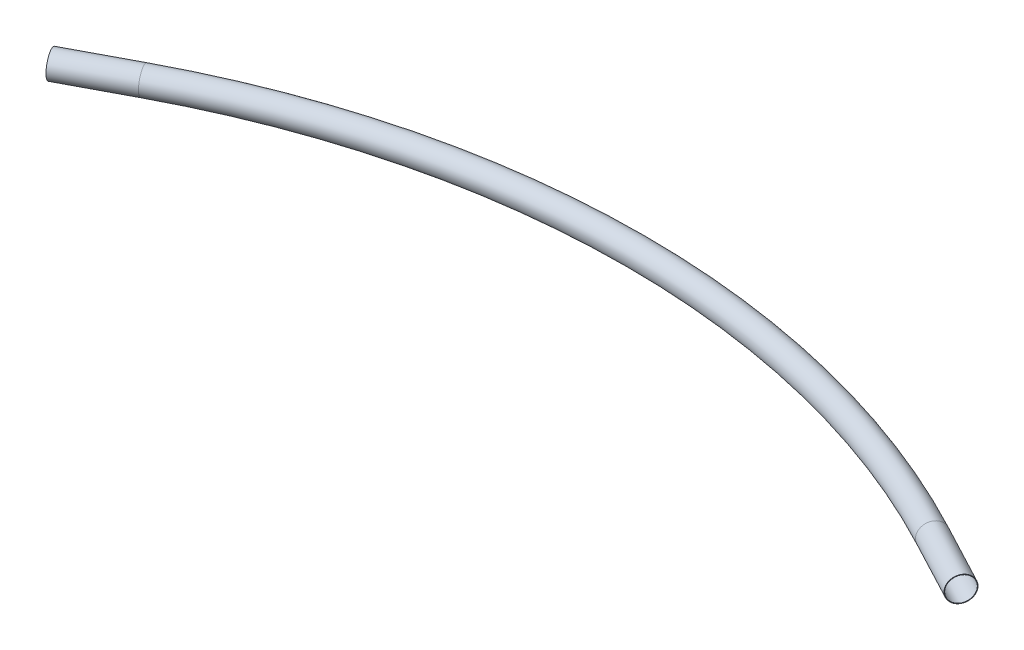
ISO-10303-21;
HEADER;
FILE_DESCRIPTION(('STEP AP214'),'2;1');
FILE_NAME('part.step','',(''),(''),'','','');
FILE_SCHEMA(('AUTOMOTIVE_DESIGN { 1 0 10303 214 1 1 1 1 }'));
ENDSEC;
DATA;
#1=APPLICATION_CONTEXT('core data for automotive mechanical design processes');
#2=APPLICATION_PROTOCOL_DEFINITION('international standard','automotive_design',2000,#1);
#3=PRODUCT_CONTEXT('',#1,'mechanical');
#4=PRODUCT('Part','Part','',(#3));
#5=PRODUCT_RELATED_PRODUCT_CATEGORY('part','',(#4));
#6=PRODUCT_DEFINITION_FORMATION('','',#4);
#7=PRODUCT_DEFINITION_CONTEXT('part definition',#1,'design');
#8=PRODUCT_DEFINITION('design','',#6,#7);
#9=PRODUCT_DEFINITION_SHAPE('','',#8);
#10=(LENGTH_UNIT() NAMED_UNIT(*) SI_UNIT(.MILLI.,.METRE.));
#11=(NAMED_UNIT(*) PLANE_ANGLE_UNIT() SI_UNIT($,.RADIAN.));
#12=(NAMED_UNIT(*) SI_UNIT($,.STERADIAN.) SOLID_ANGLE_UNIT());
#13=UNCERTAINTY_MEASURE_WITH_UNIT(LENGTH_MEASURE(1.E-05),#10,'distance_accuracy_value','');
#14=(GEOMETRIC_REPRESENTATION_CONTEXT(3) GLOBAL_UNCERTAINTY_ASSIGNED_CONTEXT((#13)) GLOBAL_UNIT_ASSIGNED_CONTEXT((#10,
#11,#12)) REPRESENTATION_CONTEXT('',''));
#15=CARTESIAN_POINT('',(0.,0.,0.));
#16=DIRECTION('',(0.,0.,1.));
#17=DIRECTION('',(1.,0.,0.));
#18=AXIS2_PLACEMENT_3D('',#15,#16,#17);
#19=CARTESIAN_POINT('',(-3039.39165417811,0.,213.778772000832));
#20=DIRECTION('',(0.883949374842753,0.,-0.467582615924828));
#21=DIRECTION('',(-0.467582615924828,0.,-0.883949374842753));
#22=AXIS2_PLACEMENT_3D('',#19,#20,#21);
#23=CYLINDRICAL_SURFACE('',#22,80.7339);
#24=CARTESIAN_POINT('',(-3039.39165417811,0.,213.778772000832));
#25=DIRECTION('',(-0.883949374842753,0.,0.467582615924828));
#26=DIRECTION('',(0.467582615924828,0.,0.883949374842753));
#27=AXIS2_PLACEMENT_3D('',#24,#25,#26);
#28=CIRCLE('',#27,80.7339);
#29=CARTESIAN_POINT('',(-3077.14142233392,0.,142.414091567214));
#30=VERTEX_POINT('',#29);
#31=EDGE_CURVE('E52',#30,#30,#28,.T.);
#32=CARTESIAN_POINT('',(-2635.25,0.,0.));
#33=DIRECTION('',(-0.883949374842753,0.,0.467582615924828));
#34=DIRECTION('',(0.467582615924828,0.,0.883949374842753));
#35=AXIS2_PLACEMENT_3D('',#32,#33,#34);
#36=CIRCLE('',#35,80.7339);
#37=CARTESIAN_POINT('',(-2672.99976815581,0.,-71.3646804336173));
#38=VERTEX_POINT('',#37);
#39=EDGE_CURVE('E58',#38,#38,#36,.T.);
#40=CARTESIAN_POINT('',(-3077.14142233392,0.,142.414091567214));
#41=CARTESIAN_POINT('',(-3072.93161343623,0.,140.187229358872));
#42=CARTESIAN_POINT('',(-3068.72180453854,0.,137.96036715053));
#43=CARTESIAN_POINT('',(-3060.30218674317,0.,133.506642733846));
#44=CARTESIAN_POINT('',(-3056.09237784548,0.,131.279780525504));
#45=CARTESIAN_POINT('',(-3047.6727600501,0.,126.82605610882));
#46=CARTESIAN_POINT('',(-3043.46295115241,0.,124.599193900478));
#47=CARTESIAN_POINT('',(-3035.04333335703,0.,120.145469483794));
#48=CARTESIAN_POINT('',(-3030.83352445935,0.,117.918607275452));
#49=CARTESIAN_POINT('',(-3022.41390666397,0.,113.464882858768));
#50=CARTESIAN_POINT('',(-3018.20409776628,0.,111.238020650426));
#51=CARTESIAN_POINT('',(-3009.7844799709,0.,106.784296233742));
#52=CARTESIAN_POINT('',(-3005.57467107321,0.,104.5574340254));
#53=CARTESIAN_POINT('',(-2997.15505327784,0.,100.103709608716));
#54=CARTESIAN_POINT('',(-2992.94524438015,0.,97.8768474003744));
#55=CARTESIAN_POINT('',(-2984.52562658477,0.,93.4231229836903));
#56=CARTESIAN_POINT('',(-2980.31581768708,0.,91.1962607753483));
#57=CARTESIAN_POINT('',(-2971.89619989171,0.,86.7425363586644));
#58=CARTESIAN_POINT('',(-2967.68639099402,0.,84.5156741503224));
#59=CARTESIAN_POINT('',(-2959.26677319864,0.,80.0619497336384));
#60=CARTESIAN_POINT('',(-2955.05696430095,0.,77.8350875252964));
#61=CARTESIAN_POINT('',(-2946.63734650557,0.,73.3813631086124));
#62=CARTESIAN_POINT('',(-2942.42753760789,0.,71.1545009002703));
#63=CARTESIAN_POINT('',(-2934.00791981251,0.,66.7007764835864));
#64=CARTESIAN_POINT('',(-2929.79811091482,0.,64.4739142752444));
#65=CARTESIAN_POINT('',(-2921.37849311944,0.,60.0201898585605));
#66=CARTESIAN_POINT('',(-2917.16868422175,0.,57.7933276502184));
#67=CARTESIAN_POINT('',(-2908.74906642638,0.,53.3396032335344));
#68=CARTESIAN_POINT('',(-2904.53925752869,0.,51.1127410251924));
#69=CARTESIAN_POINT('',(-2896.11963973331,0.,46.6590166085085));
#70=CARTESIAN_POINT('',(-2891.90983083562,0.,44.4321544001665));
#71=CARTESIAN_POINT('',(-2883.49021304024,0.,39.9784299834824));
#72=CARTESIAN_POINT('',(-2879.28040414256,0.,37.7515677751405));
#73=CARTESIAN_POINT('',(-2870.86078634718,0.,33.2978433584565));
#74=CARTESIAN_POINT('',(-2866.65097744949,0.,31.0709811501145));
#75=CARTESIAN_POINT('',(-2858.23135965411,0.,26.6172567334305));
#76=CARTESIAN_POINT('',(-2854.02155075642,0.,24.3903945250885));
#77=CARTESIAN_POINT('',(-2845.60193296105,0.,19.9366701084045));
#78=CARTESIAN_POINT('',(-2841.39212406336,0.,17.7098079000625));
#79=CARTESIAN_POINT('',(-2832.97250626798,0.,13.2560834833786));
#80=CARTESIAN_POINT('',(-2828.76269737029,0.,11.0292212750365));
#81=CARTESIAN_POINT('',(-2820.34307957492,0.,6.57549685835251));
#82=CARTESIAN_POINT('',(-2816.13327067723,0.,4.34863465001052));
#83=CARTESIAN_POINT('',(-2807.71365288185,0.,-0.10508976667346));
#84=CARTESIAN_POINT('',(-2803.50384398416,0.,-2.33195197501545));
#85=CARTESIAN_POINT('',(-2795.08422618878,0.,-6.78567639169943));
#86=CARTESIAN_POINT('',(-2790.8744172911,0.,-9.01253860004142));
#87=CARTESIAN_POINT('',(-2782.45479949572,0.,-13.4662630167254));
#88=CARTESIAN_POINT('',(-2778.24499059803,0.,-15.6931252250675));
#89=CARTESIAN_POINT('',(-2769.82537280265,0.,-20.1468496417514));
#90=CARTESIAN_POINT('',(-2765.61556390496,0.,-22.3737118500934));
#91=CARTESIAN_POINT('',(-2757.19594610959,0.,-26.8274362667774));
#92=CARTESIAN_POINT('',(-2752.9861372119,0.,-29.0542984751194));
#93=CARTESIAN_POINT('',(-2744.56651941652,0.,-33.5080228918034));
#94=CARTESIAN_POINT('',(-2740.35671051883,0.,-35.7348851001454));
#95=CARTESIAN_POINT('',(-2731.93709272345,0.,-40.1886095168294));
#96=CARTESIAN_POINT('',(-2727.72728382577,0.,-42.4154717251714));
#97=CARTESIAN_POINT('',(-2719.30766603039,0.,-46.8691961418554));
#98=CARTESIAN_POINT('',(-2715.0978571327,0.,-49.0960583501974));
#99=CARTESIAN_POINT('',(-2706.67823933732,0.,-53.5497827668813));
#100=CARTESIAN_POINT('',(-2702.46843043963,0.,-55.7766449752233));
#101=CARTESIAN_POINT('',(-2694.04881264426,0.,-60.2303693919073));
#102=CARTESIAN_POINT('',(-2689.83900374657,0.,-62.4572316002494));
#103=CARTESIAN_POINT('',(-2681.41938595119,0.,-66.9109560169334));
#104=CARTESIAN_POINT('',(-2677.2095770535,0.,-69.1378182252754));
#105=CARTESIAN_POINT('',(-2672.99976815581,0.,-71.3646804336173));
#106=B_SPLINE_CURVE_WITH_KNOTS('',3,(#40,#41,#42,#43,#44,#45,#46,#47,#48,#49,#50,#51,#52,#53,
#54,#55,#56,#57,#58,#59,#60,#61,#62,#63,#64,#65,#66,#67,#68,#69,#70,#71,#72,#73,#74,#75,#76,#77,
#78,#79,#80,#81,#82,#83,#84,#85,#86,#87,#88,#89,#90,#91,#92,#93,#94,#95,#96,#97,#98,#99,#100,
#101,#102,#103,#104,#105),.UNSPECIFIED.,.F.,.F.,(4,2,2,2,2,2,2,2,2,2,2,2,2,2,2,2,2,2,2,2,2,2,2,
2,2,2,2,2,2,2,2,2,4),(0.,14.2874999999999,28.5749999999999,42.8624999999998,57.1499999999998,
71.4374999999997,85.725,100.0125,114.3,128.5875,142.875,157.1625,171.45,185.7375,200.025,
214.3125,228.6,242.8875,257.175,271.4625,285.75,300.0375,314.325,328.6125,342.9,357.1875,
371.475,385.7625,400.05,414.3375,428.625,442.9125,457.2),.UNSPECIFIED.);
#107=EDGE_CURVE('BSEAM45',#30,#38,#106,.T.);
#108=ORIENTED_EDGE('',*,*,#31,.T.);
#109=ORIENTED_EDGE('',*,*,#39,.F.);
#110=ORIENTED_EDGE('',*,*,#107,.T.);
#111=ORIENTED_EDGE('',*,*,#107,.F.);
#112=EDGE_LOOP('',(#108,#110,#109,#111));
#113=FACE_BOUND('',#112,.T.);
#114=ADVANCED_FACE('F45',(#113),#23,.F.);
#115=CARTESIAN_POINT('',(-3039.39165417811,0.,213.778772000832));
#116=DIRECTION('',(0.883949374842753,0.,-0.467582615924828));
#117=DIRECTION('',(-0.467582615924828,0.,-0.883949374842753));
#118=AXIS2_PLACEMENT_3D('',#115,#116,#117);
#119=CYLINDRICAL_SURFACE('',#118,84.1375);
#120=CARTESIAN_POINT('',(-3039.39165417811,0.,213.778772000832));
#121=DIRECTION('',(-0.883949374842753,0.,0.467582615924828));
#122=DIRECTION('',(0.467582615924828,0.,0.883949374842753));
#123=AXIS2_PLACEMENT_3D('',#120,#121,#122);
#124=CIRCLE('',#123,84.1375);
#125=CARTESIAN_POINT('',(-3078.73288652548,0.,139.405481474999));
#126=VERTEX_POINT('',#125);
#127=EDGE_CURVE('E12',#126,#126,#124,.T.);
#128=CARTESIAN_POINT('',(-2635.25,0.,0.));
#129=DIRECTION('',(-0.883949374842753,0.,0.467582615924828));
#130=DIRECTION('',(0.467582615924828,0.,0.883949374842753));
#131=AXIS2_PLACEMENT_3D('',#128,#129,#130);
#132=CIRCLE('',#131,84.1375);
#133=CARTESIAN_POINT('',(-2674.59123234737,0.,-74.3732905258323));
#134=VERTEX_POINT('',#133);
#135=EDGE_CURVE('E48',#134,#134,#132,.T.);
#136=CARTESIAN_POINT('',(-3078.73288652548,0.,139.405481474999));
#137=CARTESIAN_POINT('',(-3074.52307762779,0.,137.178619266657));
#138=CARTESIAN_POINT('',(-3070.3132687301,0.,134.951757058315));
#139=CARTESIAN_POINT('',(-3061.89365093473,0.,130.498032641631));
#140=CARTESIAN_POINT('',(-3057.68384203704,0.,128.271170433289));
#141=CARTESIAN_POINT('',(-3049.26422424166,0.,123.817446016605));
#142=CARTESIAN_POINT('',(-3045.05441534397,0.,121.590583808263));
#143=CARTESIAN_POINT('',(-3036.6347975486,0.,117.136859391579));
#144=CARTESIAN_POINT('',(-3032.42498865091,0.,114.909997183237));
#145=CARTESIAN_POINT('',(-3024.00537085553,0.,110.456272766553));
#146=CARTESIAN_POINT('',(-3019.79556195784,0.,108.229410558211));
#147=CARTESIAN_POINT('',(-3011.37594416246,0.,103.775686141527));
#148=CARTESIAN_POINT('',(-3007.16613526478,0.,101.548823933185));
#149=CARTESIAN_POINT('',(-2998.7465174694,0.,97.0950995165014));
#150=CARTESIAN_POINT('',(-2994.53670857171,0.,94.8682373081594));
#151=CARTESIAN_POINT('',(-2986.11709077633,0.,90.4145128914754));
#152=CARTESIAN_POINT('',(-2981.90728187864,0.,88.1876506831334));
#153=CARTESIAN_POINT('',(-2973.48766408327,0.,83.7339262664494));
#154=CARTESIAN_POINT('',(-2969.27785518558,0.,81.5070640581074));
#155=CARTESIAN_POINT('',(-2960.8582373902,0.,77.0533396414234));
#156=CARTESIAN_POINT('',(-2956.64842849251,0.,74.8264774330814));
#157=CARTESIAN_POINT('',(-2948.22881069714,0.,70.3727530163975));
#158=CARTESIAN_POINT('',(-2944.01900179945,0.,68.1458908080555));
#159=CARTESIAN_POINT('',(-2935.59938400407,0.,63.6921663913714));
#160=CARTESIAN_POINT('',(-2931.38957510638,0.,61.4653041830294));
#161=CARTESIAN_POINT('',(-2922.969957311,0.,57.0115797663454));
#162=CARTESIAN_POINT('',(-2918.76014841331,0.,54.7847175580035));
#163=CARTESIAN_POINT('',(-2910.34053061794,0.,50.3309931413195));
#164=CARTESIAN_POINT('',(-2906.13072172025,0.,48.1041309329775));
#165=CARTESIAN_POINT('',(-2897.71110392487,0.,43.6504065162935));
#166=CARTESIAN_POINT('',(-2893.50129502718,0.,41.4235443079515));
#167=CARTESIAN_POINT('',(-2885.08167723181,0.,36.9698198912675));
#168=CARTESIAN_POINT('',(-2880.87186833412,0.,34.7429576829255));
#169=CARTESIAN_POINT('',(-2872.45225053874,0.,30.2892332662415));
#170=CARTESIAN_POINT('',(-2868.24244164105,0.,28.0623710578995));
#171=CARTESIAN_POINT('',(-2859.82282384567,0.,23.6086466412155));
#172=CARTESIAN_POINT('',(-2855.61301494799,0.,21.3817844328735));
#173=CARTESIAN_POINT('',(-2847.19339715261,0.,16.9280600161895));
#174=CARTESIAN_POINT('',(-2842.98358825492,0.,14.7011978078476));
#175=CARTESIAN_POINT('',(-2834.56397045954,0.,10.2474733911636));
#176=CARTESIAN_POINT('',(-2830.35416156185,0.,8.02061118282158));
#177=CARTESIAN_POINT('',(-2821.93454376648,0.,3.56688676613756));
#178=CARTESIAN_POINT('',(-2817.72473486879,0.,1.34002455779557));
#179=CARTESIAN_POINT('',(-2809.30511707341,0.,-3.11369985888842));
#180=CARTESIAN_POINT('',(-2805.09530817572,0.,-5.34056206723042));
#181=CARTESIAN_POINT('',(-2796.67569038034,0.,-9.79428648391441));
#182=CARTESIAN_POINT('',(-2792.46588148266,0.,-12.0211486922564));
#183=CARTESIAN_POINT('',(-2784.04626368728,0.,-16.4748731089404));
#184=CARTESIAN_POINT('',(-2779.83645478959,0.,-18.7017353172824));
#185=CARTESIAN_POINT('',(-2771.41683699421,0.,-23.1554597339664));
#186=CARTESIAN_POINT('',(-2767.20702809652,0.,-25.3823219423084));
#187=CARTESIAN_POINT('',(-2758.78741030115,0.,-29.8360463589924));
#188=CARTESIAN_POINT('',(-2754.57760140346,0.,-32.0629085673344));
#189=CARTESIAN_POINT('',(-2746.15798360808,0.,-36.5166329840183));
#190=CARTESIAN_POINT('',(-2741.94817471039,0.,-38.7434951923603));
#191=CARTESIAN_POINT('',(-2733.52855691502,0.,-43.1972196090443));
#192=CARTESIAN_POINT('',(-2729.31874801733,0.,-45.4240818173863));
#193=CARTESIAN_POINT('',(-2720.89913022195,0.,-49.8778062340703));
#194=CARTESIAN_POINT('',(-2716.68932132426,0.,-52.1046684424123));
#195=CARTESIAN_POINT('',(-2708.26970352888,0.,-56.5583928590963));
#196=CARTESIAN_POINT('',(-2704.0598946312,0.,-58.7852550674383));
#197=CARTESIAN_POINT('',(-2695.64027683582,0.,-63.2389794841223));
#198=CARTESIAN_POINT('',(-2691.43046793813,0.,-65.4658416924643));
#199=CARTESIAN_POINT('',(-2683.01085014275,0.,-69.9195661091483));
#200=CARTESIAN_POINT('',(-2678.80104124506,0.,-72.1464283174903));
#201=CARTESIAN_POINT('',(-2674.59123234737,0.,-74.3732905258323));
#202=B_SPLINE_CURVE_WITH_KNOTS('',3,(#136,#137,#138,#139,#140,#141,#142,#143,#144,#145,#146,
#147,#148,#149,#150,#151,#152,#153,#154,#155,#156,#157,#158,#159,#160,#161,#162,#163,#164,#165,
#166,#167,#168,#169,#170,#171,#172,#173,#174,#175,#176,#177,#178,#179,#180,#181,#182,#183,#184,
#185,#186,#187,#188,#189,#190,#191,#192,#193,#194,#195,#196,#197,#198,#199,#200,#201),
.UNSPECIFIED.,.F.,.F.,(4,2,2,2,2,2,2,2,2,2,2,2,2,2,2,2,2,2,2,2,2,2,2,2,2,2,2,2,2,2,2,2,4),(0.,
14.2874999999999,28.5749999999999,42.8624999999998,57.1499999999998,71.4374999999997,
85.7249999999997,100.0125,114.3,128.5875,142.875,157.1625,171.45,185.7375,200.025,214.3125,
228.6,242.8875,257.175,271.4625,285.75,300.0375,314.325,328.6125,342.9,357.1875,371.475,
385.7625,400.05,414.3375,428.625,442.9125,457.2),.UNSPECIFIED.);
#203=EDGE_CURVE('BSEAM65',#126,#134,#202,.T.);
#204=ORIENTED_EDGE('',*,*,#127,.F.);
#205=ORIENTED_EDGE('',*,*,#135,.T.);
#206=ORIENTED_EDGE('',*,*,#203,.T.);
#207=ORIENTED_EDGE('',*,*,#203,.F.);
#208=EDGE_LOOP('',(#204,#206,#205,#207));
#209=FACE_BOUND('',#208,.T.);
#210=ADVANCED_FACE('F65',(#209),#119,.T.);
#211=CARTESIAN_POINT('',(-3039.39165417811,0.,213.778772000832));
#212=DIRECTION('',(-0.883949374842753,0.,0.467582615924828));
#213=DIRECTION('',(0.467582615924828,0.,0.883949374842753));
#214=AXIS2_PLACEMENT_3D('',#211,#212,#213);
#215=PLANE('',#214);
#216=ORIENTED_EDGE('',*,*,#31,.F.);
#217=EDGE_LOOP('',(#216));
#218=FACE_BOUND('',#217,.T.);
#219=ORIENTED_EDGE('',*,*,#127,.T.);
#220=EDGE_LOOP('',(#219));
#221=FACE_BOUND('',#220,.T.);
#222=ADVANCED_FACE('F69',(#218,#221),#215,.T.);
#223=CARTESIAN_POINT('',(-2635.25,0.,0.));
#224=DIRECTION('',(-0.883949374842753,0.,0.467582615924828));
#225=DIRECTION('',(0.467582615924828,0.,0.883949374842753));
#226=AXIS2_PLACEMENT_3D('',#223,#224,#225);
#227=PLANE('',#226);
#228=ORIENTED_EDGE('',*,*,#39,.T.);
#229=EDGE_LOOP('',(#228));
#230=FACE_BOUND('',#229,.T.);
#231=ORIENTED_EDGE('',*,*,#135,.F.);
#232=EDGE_LOOP('',(#231));
#233=FACE_BOUND('',#232,.T.);
#234=ADVANCED_FACE('F67',(#230,#233),#227,.F.);
#235=CLOSED_SHELL('',(#114,#210,#222,#234));
#236=MANIFOLD_SOLID_BREP('B2',#235);
#237=CARTESIAN_POINT('',(0.,0.,4981.85242718447));
#238=DIRECTION('',(0.,-1.,0.));
#239=DIRECTION('',(0.,0.,-1.));
#240=AXIS2_PLACEMENT_3D('',#237,#238,#239);
#241=TOROIDAL_SURFACE('',#240,5635.90242718447,80.7339);
#242=CARTESIAN_POINT('',(-2635.25,0.,4.44089209850063E-13));
#243=DIRECTION('',(-0.883949374842753,0.,0.467582615924828));
#244=DIRECTION('',(0.467582615924828,0.,0.883949374842753));
#245=AXIS2_PLACEMENT_3D('',#242,#243,#244);
#246=CIRCLE('',#245,80.7339);
#247=CARTESIAN_POINT('',(-2672.99976815581,0.,-71.3646804336179));
#248=VERTEX_POINT('',#247);
#249=EDGE_CURVE('E129',#248,#248,#246,.T.);
#250=CARTESIAN_POINT('',(2635.25,0.,0.));
#251=DIRECTION('',(-0.883949374842754,0.,-0.467582615924828));
#252=DIRECTION('',(-0.467582615924828,0.,0.883949374842754));
#253=AXIS2_PLACEMENT_3D('',#250,#251,#252);
#254=CIRCLE('',#253,80.7339);
#255=CARTESIAN_POINT('',(2672.99976815581,0.,-71.3646804336179));
#256=VERTEX_POINT('',#255);
#257=EDGE_CURVE('E137',#256,#256,#254,.T.);
#258=CARTESIAN_POINT('',(0.,0.,4981.85242718447));
#259=DIRECTION('',(0.,-1.,0.));
#260=DIRECTION('',(0.,0.,-1.));
#261=AXIS2_PLACEMENT_3D('',#258,#259,#260);
#262=CIRCLE('',#261,5716.63632718447);
#263=EDGE_CURVE('',#248,#256,#262,.T.);
#264=ORIENTED_EDGE('',*,*,#249,.T.);
#265=ORIENTED_EDGE('',*,*,#257,.F.);
#266=ORIENTED_EDGE('',*,*,#263,.T.);
#267=ORIENTED_EDGE('',*,*,#263,.F.);
#268=EDGE_LOOP('',(#264,#266,#265,#267));
#269=FACE_BOUND('',#268,.T.);
#270=ADVANCED_FACE('F122',(#269),#241,.F.);
#271=CARTESIAN_POINT('',(0.,0.,4981.85242718447));
#272=DIRECTION('',(0.,-1.,0.));
#273=DIRECTION('',(0.,0.,-1.));
#274=AXIS2_PLACEMENT_3D('',#271,#272,#273);
#275=TOROIDAL_SURFACE('',#274,5635.90242718447,84.1375);
#276=CARTESIAN_POINT('',(-2635.25,0.,4.44089209850063E-13));
#277=DIRECTION('',(-0.883949374842753,0.,0.467582615924828));
#278=DIRECTION('',(0.467582615924828,0.,0.883949374842753));
#279=AXIS2_PLACEMENT_3D('',#276,#277,#278);
#280=CIRCLE('',#279,84.1375);
#281=CARTESIAN_POINT('',(-2674.59123234738,0.,-74.3732905258323));
#282=VERTEX_POINT('',#281);
#283=EDGE_CURVE('E44',#282,#282,#280,.T.);
#284=CARTESIAN_POINT('',(2635.25,0.,0.));
#285=DIRECTION('',(-0.883949374842754,0.,-0.467582615924828));
#286=DIRECTION('',(-0.467582615924828,0.,0.883949374842754));
#287=AXIS2_PLACEMENT_3D('',#284,#285,#286);
#288=CIRCLE('',#287,84.1375);
#289=CARTESIAN_POINT('',(2674.59123234737,0.,-74.3732905258323));
#290=VERTEX_POINT('',#289);
#291=EDGE_CURVE('E133',#290,#290,#288,.T.);
#292=CARTESIAN_POINT('',(0.,0.,4981.85242718447));
#293=DIRECTION('',(0.,-1.,0.));
#294=DIRECTION('',(0.,0.,-1.));
#295=AXIS2_PLACEMENT_3D('',#292,#293,#294);
#296=CIRCLE('',#295,5720.03992718447);
#297=EDGE_CURVE('',#282,#290,#296,.T.);
#298=ORIENTED_EDGE('',*,*,#283,.F.);
#299=ORIENTED_EDGE('',*,*,#291,.T.);
#300=ORIENTED_EDGE('',*,*,#297,.T.);
#301=ORIENTED_EDGE('',*,*,#297,.F.);
#302=EDGE_LOOP('',(#298,#300,#299,#301));
#303=FACE_BOUND('',#302,.T.);
#304=ADVANCED_FACE('F124',(#303),#275,.T.);
#305=CARTESIAN_POINT('',(-2635.25,0.,4.44089209850063E-13));
#306=DIRECTION('',(-0.883949374842753,0.,0.467582615924828));
#307=DIRECTION('',(0.467582615924828,0.,0.883949374842753));
#308=AXIS2_PLACEMENT_3D('',#305,#306,#307);
#309=PLANE('',#308);
#310=ORIENTED_EDGE('',*,*,#249,.F.);
#311=EDGE_LOOP('',(#310));
#312=FACE_BOUND('',#311,.T.);
#313=ORIENTED_EDGE('',*,*,#283,.T.);
#314=EDGE_LOOP('',(#313));
#315=FACE_BOUND('',#314,.T.);
#316=ADVANCED_FACE('F147',(#312,#315),#309,.T.);
#317=CARTESIAN_POINT('',(2635.25,0.,0.));
#318=DIRECTION('',(-0.883949374842754,0.,-0.467582615924828));
#319=DIRECTION('',(-0.467582615924828,0.,0.883949374842754));
#320=AXIS2_PLACEMENT_3D('',#317,#318,#319);
#321=PLANE('',#320);
#322=ORIENTED_EDGE('',*,*,#257,.T.);
#323=EDGE_LOOP('',(#322));
#324=FACE_BOUND('',#323,.T.);
#325=ORIENTED_EDGE('',*,*,#291,.F.);
#326=EDGE_LOOP('',(#325));
#327=FACE_BOUND('',#326,.T.);
#328=ADVANCED_FACE('F143',(#324,#327),#321,.F.);
#329=CLOSED_SHELL('',(#270,#304,#316,#328));
#330=MANIFOLD_SOLID_BREP('B7',#329);
#331=CARTESIAN_POINT('',(2635.25,0.,0.));
#332=DIRECTION('',(0.883949374842753,0.,0.467582615924828));
#333=DIRECTION('',(0.467582615924828,0.,-0.883949374842753));
#334=AXIS2_PLACEMENT_3D('',#331,#332,#333);
#335=CYLINDRICAL_SURFACE('',#334,80.7339);
#336=CARTESIAN_POINT('',(2635.25,0.,0.));
#337=DIRECTION('',(-0.883949374842754,0.,-0.467582615924828));
#338=DIRECTION('',(-0.467582615924828,0.,0.883949374842754));
#339=AXIS2_PLACEMENT_3D('',#336,#337,#338);
#340=CIRCLE('',#339,80.7339);
#341=CARTESIAN_POINT('',(2672.99976815581,0.,-71.3646804336173));
#342=VERTEX_POINT('',#341);
#343=EDGE_CURVE('E199',#342,#342,#340,.T.);
#344=CARTESIAN_POINT('',(3039.39165417811,0.,213.778772000832));
#345=DIRECTION('',(-0.883949374842754,0.,-0.467582615924828));
#346=DIRECTION('',(-0.467582615924828,0.,0.883949374842754));
#347=AXIS2_PLACEMENT_3D('',#344,#345,#346);
#348=CIRCLE('',#347,80.7339);
#349=CARTESIAN_POINT('',(3077.14142233392,0.,142.414091567214));
#350=VERTEX_POINT('',#349);
#351=EDGE_CURVE('E205',#350,#350,#348,.T.);
#352=CARTESIAN_POINT('',(2672.99976815581,0.,-71.3646804336173));
#353=CARTESIAN_POINT('',(2677.2095770535,0.,-69.1378182252752));
#354=CARTESIAN_POINT('',(2681.41938595119,0.,-66.9109560169333));
#355=CARTESIAN_POINT('',(2689.83900374657,0.,-62.4572316002493));
#356=CARTESIAN_POINT('',(2694.04881264426,0.,-60.2303693919074));
#357=CARTESIAN_POINT('',(2702.46843043963,0.,-55.7766449752234));
#358=CARTESIAN_POINT('',(2706.67823933732,0.,-53.5497827668814));
#359=CARTESIAN_POINT('',(2715.0978571327,0.,-49.0960583501974));
#360=CARTESIAN_POINT('',(2719.30766603039,0.,-46.8691961418554));
#361=CARTESIAN_POINT('',(2727.72728382577,0.,-42.4154717251714));
#362=CARTESIAN_POINT('',(2731.93709272345,0.,-40.1886095168294));
#363=CARTESIAN_POINT('',(2740.35671051883,0.,-35.7348851001454));
#364=CARTESIAN_POINT('',(2744.56651941652,0.,-33.5080228918034));
#365=CARTESIAN_POINT('',(2752.9861372119,0.,-29.0542984751194));
#366=CARTESIAN_POINT('',(2757.19594610959,0.,-26.8274362667774));
#367=CARTESIAN_POINT('',(2765.61556390496,0.,-22.3737118500934));
#368=CARTESIAN_POINT('',(2769.82537280265,0.,-20.1468496417514));
#369=CARTESIAN_POINT('',(2778.24499059803,0.,-15.6931252250674));
#370=CARTESIAN_POINT('',(2782.45479949572,0.,-13.4662630167255));
#371=CARTESIAN_POINT('',(2790.8744172911,0.,-9.01253860004149));
#372=CARTESIAN_POINT('',(2795.08422618878,0.,-6.78567639169947));
#373=CARTESIAN_POINT('',(2803.50384398416,0.,-2.33195197501546));
#374=CARTESIAN_POINT('',(2807.71365288185,0.,-0.105089766673477));
#375=CARTESIAN_POINT('',(2816.13327067723,0.,4.34863465001051));
#376=CARTESIAN_POINT('',(2820.34307957492,0.,6.57549685835251));
#377=CARTESIAN_POINT('',(2828.76269737029,0.,11.0292212750365));
#378=CARTESIAN_POINT('',(2832.97250626798,0.,13.2560834833785));
#379=CARTESIAN_POINT('',(2841.39212406336,0.,17.7098079000625));
#380=CARTESIAN_POINT('',(2845.60193296105,0.,19.9366701084045));
#381=CARTESIAN_POINT('',(2854.02155075642,0.,24.3903945250885));
#382=CARTESIAN_POINT('',(2858.23135965411,0.,26.6172567334304));
#383=CARTESIAN_POINT('',(2866.65097744949,0.,31.0709811501144));
#384=CARTESIAN_POINT('',(2870.86078634718,0.,33.2978433584564));
#385=CARTESIAN_POINT('',(2879.28040414256,0.,37.7515677751405));
#386=CARTESIAN_POINT('',(2883.49021304024,0.,39.9784299834824));
#387=CARTESIAN_POINT('',(2891.90983083562,0.,44.4321544001664));
#388=CARTESIAN_POINT('',(2896.11963973331,0.,46.6590166085084));
#389=CARTESIAN_POINT('',(2904.53925752869,0.,51.1127410251924));
#390=CARTESIAN_POINT('',(2908.74906642638,0.,53.3396032335344));
#391=CARTESIAN_POINT('',(2917.16868422175,0.,57.7933276502184));
#392=CARTESIAN_POINT('',(2921.37849311944,0.,60.0201898585604));
#393=CARTESIAN_POINT('',(2929.79811091482,0.,64.4739142752444));
#394=CARTESIAN_POINT('',(2934.00791981251,0.,66.7007764835864));
#395=CARTESIAN_POINT('',(2942.42753760788,0.,71.1545009002704));
#396=CARTESIAN_POINT('',(2946.63734650557,0.,73.3813631086123));
#397=CARTESIAN_POINT('',(2955.05696430095,0.,77.8350875252963));
#398=CARTESIAN_POINT('',(2959.26677319864,0.,80.0619497336383));
#399=CARTESIAN_POINT('',(2967.68639099402,0.,84.5156741503224));
#400=CARTESIAN_POINT('',(2971.89619989171,0.,86.7425363586643));
#401=CARTESIAN_POINT('',(2980.31581768708,0.,91.1962607753483));
#402=CARTESIAN_POINT('',(2984.52562658477,0.,93.4231229836903));
#403=CARTESIAN_POINT('',(2992.94524438015,0.,97.8768474003743));
#404=CARTESIAN_POINT('',(2997.15505327784,0.,100.103709608716));
#405=CARTESIAN_POINT('',(3005.57467107321,0.,104.5574340254));
#406=CARTESIAN_POINT('',(3009.7844799709,0.,106.784296233742));
#407=CARTESIAN_POINT('',(3018.20409776628,0.,111.238020650426));
#408=CARTESIAN_POINT('',(3022.41390666397,0.,113.464882858768));
#409=CARTESIAN_POINT('',(3030.83352445935,0.,117.918607275452));
#410=CARTESIAN_POINT('',(3035.04333335703,0.,120.145469483794));
#411=CARTESIAN_POINT('',(3043.46295115241,0.,124.599193900478));
#412=CARTESIAN_POINT('',(3047.6727600501,0.,126.82605610882));
#413=CARTESIAN_POINT('',(3056.09237784548,0.,131.279780525504));
#414=CARTESIAN_POINT('',(3060.30218674317,0.,133.506642733846));
#415=CARTESIAN_POINT('',(3068.72180453854,0.,137.96036715053));
#416=CARTESIAN_POINT('',(3072.93161343623,0.,140.187229358872));
#417=CARTESIAN_POINT('',(3077.14142233392,0.,142.414091567214));
#418=B_SPLINE_CURVE_WITH_KNOTS('',3,(#352,#353,#354,#355,#356,#357,#358,#359,#360,#361,#362,
#363,#364,#365,#366,#367,#368,#369,#370,#371,#372,#373,#374,#375,#376,#377,#378,#379,#380,#381,
#382,#383,#384,#385,#386,#387,#388,#389,#390,#391,#392,#393,#394,#395,#396,#397,#398,#399,#400,
#401,#402,#403,#404,#405,#406,#407,#408,#409,#410,#411,#412,#413,#414,#415,#416,#417),
.UNSPECIFIED.,.F.,.F.,(4,2,2,2,2,2,2,2,2,2,2,2,2,2,2,2,2,2,2,2,2,2,2,2,2,2,2,2,2,2,2,2,4),(0.,
14.2874999999999,28.5750000000003,42.8625000000002,57.1500000000001,71.4375000000001,85.725,
100.0125,114.3,128.5875,142.875,157.1625,171.45,185.7375,200.025,214.3125,228.6,242.8875,
257.175,271.4625,285.75,300.0375,314.325,328.6125,342.9,357.1875,371.475,385.7625,400.05,
414.3375,428.625,442.9125,457.2),.UNSPECIFIED.);
#419=EDGE_CURVE('BSEAM192',#342,#350,#418,.T.);
#420=ORIENTED_EDGE('',*,*,#343,.T.);
#421=ORIENTED_EDGE('',*,*,#351,.F.);
#422=ORIENTED_EDGE('',*,*,#419,.T.);
#423=ORIENTED_EDGE('',*,*,#419,.F.);
#424=EDGE_LOOP('',(#420,#422,#421,#423));
#425=FACE_BOUND('',#424,.T.);
#426=ADVANCED_FACE('F192',(#425),#335,.F.);
#427=CARTESIAN_POINT('',(2635.25,0.,0.));
#428=DIRECTION('',(0.883949374842753,0.,0.467582615924828));
#429=DIRECTION('',(0.467582615924828,0.,-0.883949374842753));
#430=AXIS2_PLACEMENT_3D('',#427,#428,#429);
#431=CYLINDRICAL_SURFACE('',#430,84.1375);
#432=CARTESIAN_POINT('',(2635.25,0.,0.));
#433=DIRECTION('',(-0.883949374842754,0.,-0.467582615924828));
#434=DIRECTION('',(-0.467582615924828,0.,0.883949374842754));
#435=AXIS2_PLACEMENT_3D('',#432,#433,#434);
#436=CIRCLE('',#435,84.1375);
#437=CARTESIAN_POINT('',(2674.59123234737,0.,-74.3732905258322));
#438=VERTEX_POINT('',#437);
#439=EDGE_CURVE('E121',#438,#438,#436,.T.);
#440=CARTESIAN_POINT('',(3039.39165417811,0.,213.778772000832));
#441=DIRECTION('',(-0.883949374842754,0.,-0.467582615924828));
#442=DIRECTION('',(-0.467582615924828,0.,0.883949374842754));
#443=AXIS2_PLACEMENT_3D('',#440,#441,#442);
#444=CIRCLE('',#443,84.1375);
#445=CARTESIAN_POINT('',(3078.73288652548,0.,139.405481474999));
#446=VERTEX_POINT('',#445);
#447=EDGE_CURVE('E195',#446,#446,#444,.T.);
#448=CARTESIAN_POINT('',(2674.59123234737,0.,-74.3732905258322));
#449=CARTESIAN_POINT('',(2678.80104124506,0.,-72.1464283174903));
#450=CARTESIAN_POINT('',(2683.01085014275,0.,-69.9195661091483));
#451=CARTESIAN_POINT('',(2691.43046793813,0.,-65.4658416924643));
#452=CARTESIAN_POINT('',(2695.64027683582,0.,-63.2389794841223));
#453=CARTESIAN_POINT('',(2704.0598946312,0.,-58.7852550674383));
#454=CARTESIAN_POINT('',(2708.26970352888,0.,-56.5583928590963));
#455=CARTESIAN_POINT('',(2716.68932132426,0.,-52.1046684424123));
#456=CARTESIAN_POINT('',(2720.89913022195,0.,-49.8778062340703));
#457=CARTESIAN_POINT('',(2729.31874801733,0.,-45.4240818173863));
#458=CARTESIAN_POINT('',(2733.52855691502,0.,-43.1972196090443));
#459=CARTESIAN_POINT('',(2741.94817471039,0.,-38.7434951923603));
#460=CARTESIAN_POINT('',(2746.15798360808,0.,-36.5166329840183));
#461=CARTESIAN_POINT('',(2754.57760140346,0.,-32.0629085673343));
#462=CARTESIAN_POINT('',(2758.78741030115,0.,-29.8360463589924));
#463=CARTESIAN_POINT('',(2767.20702809652,0.,-25.3823219423084));
#464=CARTESIAN_POINT('',(2771.41683699421,0.,-23.1554597339664));
#465=CARTESIAN_POINT('',(2779.83645478959,0.,-18.7017353172824));
#466=CARTESIAN_POINT('',(2784.04626368728,0.,-16.4748731089404));
#467=CARTESIAN_POINT('',(2792.46588148266,0.,-12.0211486922564));
#468=CARTESIAN_POINT('',(2796.67569038034,0.,-9.79428648391438));
#469=CARTESIAN_POINT('',(2805.09530817572,0.,-5.34056206723039));
#470=CARTESIAN_POINT('',(2809.30511707341,0.,-3.1136998588884));
#471=CARTESIAN_POINT('',(2817.72473486879,0.,1.34002455779561));
#472=CARTESIAN_POINT('',(2821.93454376648,0.,3.56688676613764));
#473=CARTESIAN_POINT('',(2830.35416156185,0.,8.02061118282161));
#474=CARTESIAN_POINT('',(2834.56397045954,0.,10.2474733911636));
#475=CARTESIAN_POINT('',(2842.98358825492,0.,14.7011978078475));
#476=CARTESIAN_POINT('',(2847.19339715261,0.,16.9280600161895));
#477=CARTESIAN_POINT('',(2855.61301494799,0.,21.3817844328736));
#478=CARTESIAN_POINT('',(2859.82282384567,0.,23.6086466412156));
#479=CARTESIAN_POINT('',(2868.24244164105,0.,28.0623710578995));
#480=CARTESIAN_POINT('',(2872.45225053874,0.,30.2892332662415));
#481=CARTESIAN_POINT('',(2880.87186833412,0.,34.7429576829255));
#482=CARTESIAN_POINT('',(2885.08167723181,0.,36.9698198912675));
#483=CARTESIAN_POINT('',(2893.50129502718,0.,41.4235443079515));
#484=CARTESIAN_POINT('',(2897.71110392487,0.,43.6504065162935));
#485=CARTESIAN_POINT('',(2906.13072172025,0.,48.1041309329775));
#486=CARTESIAN_POINT('',(2910.34053061794,0.,50.3309931413195));
#487=CARTESIAN_POINT('',(2918.76014841331,0.,54.7847175580035));
#488=CARTESIAN_POINT('',(2922.969957311,0.,57.0115797663454));
#489=CARTESIAN_POINT('',(2931.38957510638,0.,61.4653041830294));
#490=CARTESIAN_POINT('',(2935.59938400407,0.,63.6921663913715));
#491=CARTESIAN_POINT('',(2944.01900179945,0.,68.1458908080555));
#492=CARTESIAN_POINT('',(2948.22881069714,0.,70.3727530163975));
#493=CARTESIAN_POINT('',(2956.64842849251,0.,74.8264774330815));
#494=CARTESIAN_POINT('',(2960.8582373902,0.,77.0533396414234));
#495=CARTESIAN_POINT('',(2969.27785518558,0.,81.5070640581074));
#496=CARTESIAN_POINT('',(2973.48766408327,0.,83.7339262664494));
#497=CARTESIAN_POINT('',(2981.90728187864,0.,88.1876506831334));
#498=CARTESIAN_POINT('',(2986.11709077633,0.,90.4145128914754));
#499=CARTESIAN_POINT('',(2994.53670857171,0.,94.8682373081594));
#500=CARTESIAN_POINT('',(2998.7465174694,0.,97.0950995165014));
#501=CARTESIAN_POINT('',(3007.16613526478,0.,101.548823933185));
#502=CARTESIAN_POINT('',(3011.37594416246,0.,103.775686141527));
#503=CARTESIAN_POINT('',(3019.79556195784,0.,108.229410558211));
#504=CARTESIAN_POINT('',(3024.00537085553,0.,110.456272766553));
#505=CARTESIAN_POINT('',(3032.42498865091,0.,114.909997183237));
#506=CARTESIAN_POINT('',(3036.6347975486,0.,117.136859391579));
#507=CARTESIAN_POINT('',(3045.05441534397,0.,121.590583808263));
#508=CARTESIAN_POINT('',(3049.26422424166,0.,123.817446016605));
#509=CARTESIAN_POINT('',(3057.68384203704,0.,128.271170433289));
#510=CARTESIAN_POINT('',(3061.89365093473,0.,130.498032641631));
#511=CARTESIAN_POINT('',(3070.3132687301,0.,134.951757058315));
#512=CARTESIAN_POINT('',(3074.52307762779,0.,137.178619266657));
#513=CARTESIAN_POINT('',(3078.73288652548,0.,139.405481474999));
#514=B_SPLINE_CURVE_WITH_KNOTS('',3,(#448,#449,#450,#451,#452,#453,#454,#455,#456,#457,#458,
#459,#460,#461,#462,#463,#464,#465,#466,#467,#468,#469,#470,#471,#472,#473,#474,#475,#476,#477,
#478,#479,#480,#481,#482,#483,#484,#485,#486,#487,#488,#489,#490,#491,#492,#493,#494,#495,#496,
#497,#498,#499,#500,#501,#502,#503,#504,#505,#506,#507,#508,#509,#510,#511,#512,#513),
.UNSPECIFIED.,.F.,.F.,(4,2,2,2,2,2,2,2,2,2,2,2,2,2,2,2,2,2,2,2,2,2,2,2,2,2,2,2,2,2,2,2,4),(0.,
14.2875000000003,28.5750000000003,42.8625000000002,57.1500000000002,71.4375000000001,85.725,
100.0125,114.3,128.5875,142.875,157.1625,171.45,185.7375,200.025,214.3125,228.6,242.8875,
257.175,271.4625,285.75,300.0375,314.325,328.6125,342.9,357.1875,371.475000000001,
385.762500000001,400.05,414.3375,428.625,442.9125,457.2),.UNSPECIFIED.);
#515=EDGE_CURVE('BSEAM212',#438,#446,#514,.T.);
#516=ORIENTED_EDGE('',*,*,#439,.F.);
#517=ORIENTED_EDGE('',*,*,#447,.T.);
#518=ORIENTED_EDGE('',*,*,#515,.T.);
#519=ORIENTED_EDGE('',*,*,#515,.F.);
#520=EDGE_LOOP('',(#516,#518,#517,#519));
#521=FACE_BOUND('',#520,.T.);
#522=ADVANCED_FACE('F212',(#521),#431,.T.);
#523=CARTESIAN_POINT('',(2635.25,0.,0.));
#524=DIRECTION('',(-0.883949374842754,0.,-0.467582615924828));
#525=DIRECTION('',(-0.467582615924828,0.,0.883949374842754));
#526=AXIS2_PLACEMENT_3D('',#523,#524,#525);
#527=PLANE('',#526);
#528=ORIENTED_EDGE('',*,*,#343,.F.);
#529=EDGE_LOOP('',(#528));
#530=FACE_BOUND('',#529,.T.);
#531=ORIENTED_EDGE('',*,*,#439,.T.);
#532=EDGE_LOOP('',(#531));
#533=FACE_BOUND('',#532,.T.);
#534=ADVANCED_FACE('F216',(#530,#533),#527,.T.);
#535=CARTESIAN_POINT('',(3039.39165417811,0.,213.778772000832));
#536=DIRECTION('',(-0.883949374842754,0.,-0.467582615924828));
#537=DIRECTION('',(-0.467582615924828,0.,0.883949374842754));
#538=AXIS2_PLACEMENT_3D('',#535,#536,#537);
#539=PLANE('',#538);
#540=ORIENTED_EDGE('',*,*,#351,.T.);
#541=EDGE_LOOP('',(#540));
#542=FACE_BOUND('',#541,.T.);
#543=ORIENTED_EDGE('',*,*,#447,.F.);
#544=EDGE_LOOP('',(#543));
#545=FACE_BOUND('',#544,.T.);
#546=ADVANCED_FACE('F214',(#542,#545),#539,.F.);
#547=CLOSED_SHELL('',(#426,#522,#534,#546));
#548=MANIFOLD_SOLID_BREP('B39',#547);
#549=ADVANCED_BREP_SHAPE_REPRESENTATION('',(#18,#236,#330,#548),#14);
#550=SHAPE_DEFINITION_REPRESENTATION(#9,#549);
ENDSEC;
END-ISO-10303-21;
